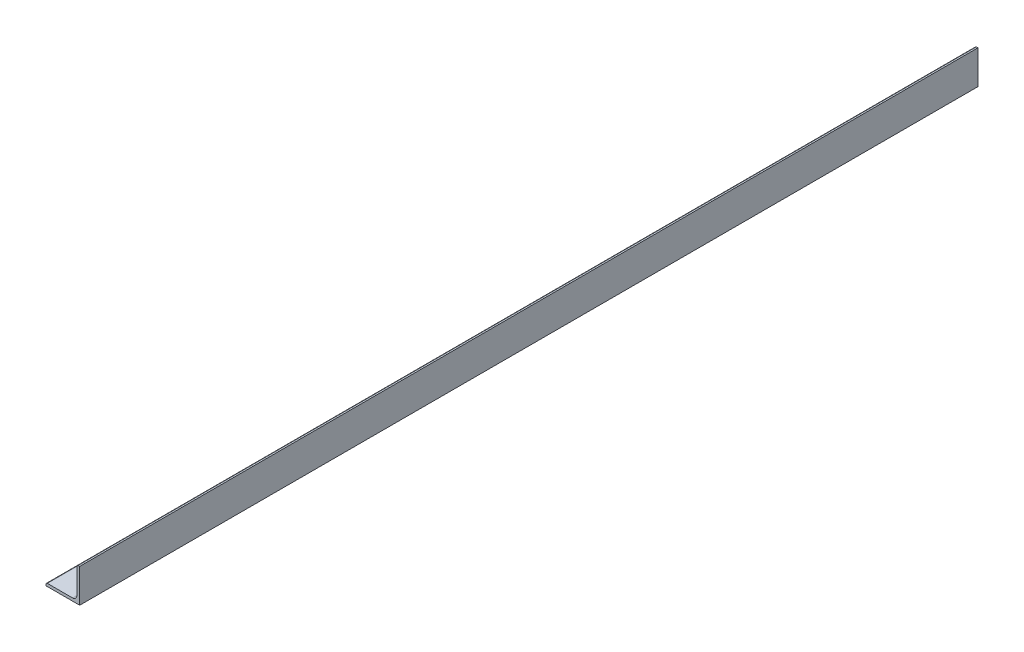
ISO-10303-21;
HEADER;
FILE_DESCRIPTION(('STEP AP214'),'2;1');
FILE_NAME('part.step','',(''),(''),'','','');
FILE_SCHEMA(('AUTOMOTIVE_DESIGN { 1 0 10303 214 1 1 1 1 }'));
ENDSEC;
DATA;
#1=APPLICATION_CONTEXT('core data for automotive mechanical design processes');
#2=APPLICATION_PROTOCOL_DEFINITION('international standard','automotive_design',2000,#1);
#3=PRODUCT_CONTEXT('',#1,'mechanical');
#4=PRODUCT('Part','Part','',(#3));
#5=PRODUCT_RELATED_PRODUCT_CATEGORY('part','',(#4));
#6=PRODUCT_DEFINITION_FORMATION('','',#4);
#7=PRODUCT_DEFINITION_CONTEXT('part definition',#1,'design');
#8=PRODUCT_DEFINITION('design','',#6,#7);
#9=PRODUCT_DEFINITION_SHAPE('','',#8);
#10=(LENGTH_UNIT() NAMED_UNIT(*) SI_UNIT(.MILLI.,.METRE.));
#11=(NAMED_UNIT(*) PLANE_ANGLE_UNIT() SI_UNIT($,.RADIAN.));
#12=(NAMED_UNIT(*) SI_UNIT($,.STERADIAN.) SOLID_ANGLE_UNIT());
#13=UNCERTAINTY_MEASURE_WITH_UNIT(LENGTH_MEASURE(1.E-05),#10,'distance_accuracy_value','');
#14=(GEOMETRIC_REPRESENTATION_CONTEXT(3) GLOBAL_UNCERTAINTY_ASSIGNED_CONTEXT((#13)) GLOBAL_UNIT_ASSIGNED_CONTEXT((#10,
#11,#12)) REPRESENTATION_CONTEXT('',''));
#15=CARTESIAN_POINT('',(0.,0.,0.));
#16=DIRECTION('',(0.,0.,1.));
#17=DIRECTION('',(1.,0.,0.));
#18=AXIS2_PLACEMENT_3D('',#15,#16,#17);
#19=CARTESIAN_POINT('',(-9.525,-8.73125000000001,254.));
#20=DIRECTION('',(1.,0.,0.));
#21=DIRECTION('',(0.,0.,-1.));
#22=AXIS2_PLACEMENT_3D('',#19,#20,#21);
#23=PLANE('',#22);
#24=DIRECTION('',(0.,-1.,0.));
#25=VECTOR('',#24,1.);
#26=CARTESIAN_POINT('',(-9.525,-8.73125000000001,-254.));
#27=LINE('',#26,#25);
#28=CARTESIAN_POINT('',(-9.525,-8.73125000000001,-254.));
#29=VERTEX_POINT('',#28);
#30=CARTESIAN_POINT('',(-9.525,-9.525,-254.));
#31=VERTEX_POINT('',#30);
#32=EDGE_CURVE('E236',#29,#31,#27,.T.);
#33=ORIENTED_EDGE('',*,*,#32,.T.);
#34=DIRECTION('',(0.,0.,-1.));
#35=VECTOR('',#34,1.);
#36=CARTESIAN_POINT('',(-9.525,-9.525,254.));
#37=LINE('',#36,#35);
#38=CARTESIAN_POINT('',(-9.525,-9.525,254.));
#39=VERTEX_POINT('',#38);
#40=EDGE_CURVE('E309',#39,#31,#37,.T.);
#41=ORIENTED_EDGE('',*,*,#40,.F.);
#42=DIRECTION('',(0.,-1.,0.));
#43=VECTOR('',#42,1.);
#44=CARTESIAN_POINT('',(-9.525,-8.73125000000001,254.));
#45=LINE('',#44,#43);
#46=CARTESIAN_POINT('',(-9.525,-8.73125000000001,254.));
#47=VERTEX_POINT('',#46);
#48=EDGE_CURVE('E237',#47,#39,#45,.T.);
#49=ORIENTED_EDGE('',*,*,#48,.F.);
#50=DIRECTION('',(0.,0.,-1.));
#51=VECTOR('',#50,1.);
#52=CARTESIAN_POINT('',(-9.525,-8.73125000000001,254.));
#53=LINE('',#52,#51);
#54=EDGE_CURVE('E170',#47,#29,#53,.T.);
#55=ORIENTED_EDGE('',*,*,#54,.T.);
#56=EDGE_LOOP('',(#33,#41,#49,#55));
#57=FACE_BOUND('',#56,.T.);
#58=ADVANCED_FACE('F45',(#57),#23,.F.);
#59=CARTESIAN_POINT('',(-9.525,-9.525,254.));
#60=DIRECTION('',(0.,1.,0.));
#61=DIRECTION('',(-1.,0.,0.));
#62=AXIS2_PLACEMENT_3D('',#59,#60,#61);
#63=PLANE('',#62);
#64=CARTESIAN_POINT('',(3.17499999999998,-9.525,-241.3));
#65=DIRECTION('',(0.,-1.,0.));
#66=DIRECTION('',(0.,0.,-1.));
#67=AXIS2_PLACEMENT_3D('',#64,#65,#66);
#68=CIRCLE('',#67,2.48919999999999);
#69=CARTESIAN_POINT('',(3.17499999999998,-9.525,-243.7892));
#70=VERTEX_POINT('',#69);
#71=EDGE_CURVE('E154',#70,#70,#68,.T.);
#72=ORIENTED_EDGE('',*,*,#71,.F.);
#73=EDGE_LOOP('',(#72));
#74=FACE_BOUND('',#73,.T.);
#75=CARTESIAN_POINT('',(3.17499999999997,-9.525,-215.9));
#76=DIRECTION('',(0.,-1.,0.));
#77=DIRECTION('',(0.,0.,-1.));
#78=AXIS2_PLACEMENT_3D('',#75,#76,#77);
#79=CIRCLE('',#78,2.48919999999999);
#80=CARTESIAN_POINT('',(3.17499999999997,-9.525,-218.3892));
#81=VERTEX_POINT('',#80);
#82=EDGE_CURVE('E153',#81,#81,#79,.T.);
#83=ORIENTED_EDGE('',*,*,#82,.F.);
#84=EDGE_LOOP('',(#83));
#85=FACE_BOUND('',#84,.T.);
#86=CARTESIAN_POINT('',(3.17499999999961,-9.525,241.3));
#87=DIRECTION('',(0.,-1.,0.));
#88=DIRECTION('',(0.,0.,-1.));
#89=AXIS2_PLACEMENT_3D('',#86,#87,#88);
#90=CIRCLE('',#89,2.48919999999999);
#91=CARTESIAN_POINT('',(3.17499999999961,-9.525,238.8108));
#92=VERTEX_POINT('',#91);
#93=EDGE_CURVE('E229',#92,#92,#90,.T.);
#94=ORIENTED_EDGE('',*,*,#93,.F.);
#95=EDGE_LOOP('',(#94));
#96=FACE_BOUND('',#95,.T.);
#97=CARTESIAN_POINT('',(3.17499999999963,-9.525,215.9));
#98=DIRECTION('',(0.,-1.,0.));
#99=DIRECTION('',(0.,0.,-1.));
#100=AXIS2_PLACEMENT_3D('',#97,#98,#99);
#101=CIRCLE('',#100,2.48919999999999);
#102=CARTESIAN_POINT('',(3.17499999999963,-9.525,213.4108));
#103=VERTEX_POINT('',#102);
#104=EDGE_CURVE('E228',#103,#103,#101,.T.);
#105=ORIENTED_EDGE('',*,*,#104,.F.);
#106=EDGE_LOOP('',(#105));
#107=FACE_BOUND('',#106,.T.);
#108=DIRECTION('',(1.,0.,0.));
#109=VECTOR('',#108,1.);
#110=CARTESIAN_POINT('',(-9.525,-9.525,-254.));
#111=LINE('',#110,#109);
#112=CARTESIAN_POINT('',(9.525,-9.525,-254.));
#113=VERTEX_POINT('',#112);
#114=EDGE_CURVE('E269',#31,#113,#111,.T.);
#115=ORIENTED_EDGE('',*,*,#114,.T.);
#116=DIRECTION('',(0.,0.,-1.));
#117=VECTOR('',#116,1.);
#118=CARTESIAN_POINT('',(9.525,-9.525,254.));
#119=LINE('',#118,#117);
#120=CARTESIAN_POINT('',(9.525,-9.525,254.));
#121=VERTEX_POINT('',#120);
#122=EDGE_CURVE('E312',#121,#113,#119,.T.);
#123=ORIENTED_EDGE('',*,*,#122,.F.);
#124=DIRECTION('',(1.,0.,0.));
#125=VECTOR('',#124,1.);
#126=CARTESIAN_POINT('',(-9.525,-9.525,254.));
#127=LINE('',#126,#125);
#128=EDGE_CURVE('E241',#39,#121,#127,.T.);
#129=ORIENTED_EDGE('',*,*,#128,.F.);
#130=ORIENTED_EDGE('',*,*,#40,.T.);
#131=EDGE_LOOP('',(#115,#123,#129,#130));
#132=FACE_BOUND('',#131,.T.);
#133=ADVANCED_FACE('F310',(#74,#85,#96,#107,#132),#63,.F.);
#134=CARTESIAN_POINT('',(9.525,-9.525,254.));
#135=DIRECTION('',(-1.,0.,0.));
#136=DIRECTION('',(0.,-1.,0.));
#137=AXIS2_PLACEMENT_3D('',#134,#135,#136);
#138=PLANE('',#137);
#139=DIRECTION('',(0.,1.,0.));
#140=VECTOR('',#139,1.);
#141=CARTESIAN_POINT('',(9.525,-9.525,-254.));
#142=LINE('',#141,#140);
#143=CARTESIAN_POINT('',(9.525,9.525,-254.));
#144=VERTEX_POINT('',#143);
#145=EDGE_CURVE('E272',#113,#144,#142,.T.);
#146=ORIENTED_EDGE('',*,*,#145,.T.);
#147=DIRECTION('',(0.,0.,-1.));
#148=VECTOR('',#147,1.);
#149=CARTESIAN_POINT('',(9.525,9.525,254.));
#150=LINE('',#149,#148);
#151=CARTESIAN_POINT('',(9.525,9.525,254.));
#152=VERTEX_POINT('',#151);
#153=EDGE_CURVE('E316',#152,#144,#150,.T.);
#154=ORIENTED_EDGE('',*,*,#153,.F.);
#155=DIRECTION('',(0.,1.,0.));
#156=VECTOR('',#155,1.);
#157=CARTESIAN_POINT('',(9.525,-9.525,254.));
#158=LINE('',#157,#156);
#159=EDGE_CURVE('E245',#121,#152,#158,.T.);
#160=ORIENTED_EDGE('',*,*,#159,.F.);
#161=ORIENTED_EDGE('',*,*,#122,.T.);
#162=EDGE_LOOP('',(#146,#154,#160,#161));
#163=FACE_BOUND('',#162,.T.);
#164=ADVANCED_FACE('F358',(#163),#138,.F.);
#165=CARTESIAN_POINT('',(8.73125000000001,9.525,254.));
#166=DIRECTION('',(0.,-1.,0.));
#167=DIRECTION('',(1.,0.,0.));
#168=AXIS2_PLACEMENT_3D('',#165,#166,#167);
#169=PLANE('',#168);
#170=DIRECTION('',(-1.,0.,0.));
#171=VECTOR('',#170,1.);
#172=CARTESIAN_POINT('',(8.73125000000001,9.525,-254.));
#173=LINE('',#172,#171);
#174=CARTESIAN_POINT('',(8.73125000000001,9.525,-254.));
#175=VERTEX_POINT('',#174);
#176=EDGE_CURVE('E275',#144,#175,#173,.T.);
#177=ORIENTED_EDGE('',*,*,#176,.T.);
#178=DIRECTION('',(0.,0.,-1.));
#179=VECTOR('',#178,1.);
#180=CARTESIAN_POINT('',(8.73125000000001,9.525,254.));
#181=LINE('',#180,#179);
#182=CARTESIAN_POINT('',(8.73125000000001,9.525,254.));
#183=VERTEX_POINT('',#182);
#184=EDGE_CURVE('E326',#183,#175,#181,.T.);
#185=ORIENTED_EDGE('',*,*,#184,.F.);
#186=DIRECTION('',(-1.,0.,0.));
#187=VECTOR('',#186,1.);
#188=CARTESIAN_POINT('',(8.73125000000001,9.525,254.));
#189=LINE('',#188,#187);
#190=EDGE_CURVE('E248',#152,#183,#189,.T.);
#191=ORIENTED_EDGE('',*,*,#190,.F.);
#192=ORIENTED_EDGE('',*,*,#153,.T.);
#193=EDGE_LOOP('',(#177,#185,#191,#192));
#194=FACE_BOUND('',#193,.T.);
#195=ADVANCED_FACE('F363',(#194),#169,.F.);
#196=CARTESIAN_POINT('',(8.73125000000001,8.73125000000002,254.));
#197=DIRECTION('',(0.,0.,-1.));
#198=DIRECTION('',(-1.,0.,0.));
#199=AXIS2_PLACEMENT_3D('',#196,#197,#198);
#200=CYLINDRICAL_SURFACE('',#199,0.793749999999986);
#201=CARTESIAN_POINT('',(8.73125000000001,8.73125000000002,-254.));
#202=DIRECTION('',(0.,0.,1.));
#203=DIRECTION('',(-1.,0.,0.));
#204=AXIS2_PLACEMENT_3D('',#201,#202,#203);
#205=CIRCLE('',#204,0.793749999999986);
#206=CARTESIAN_POINT('',(7.93750000000003,8.73125000000002,-254.));
#207=VERTEX_POINT('',#206);
#208=EDGE_CURVE('E278',#175,#207,#205,.T.);
#209=ORIENTED_EDGE('',*,*,#208,.T.);
#210=DIRECTION('',(0.,0.,-1.));
#211=VECTOR('',#210,1.);
#212=CARTESIAN_POINT('',(7.93750000000003,8.73125000000002,254.));
#213=LINE('',#212,#211);
#214=CARTESIAN_POINT('',(7.93750000000003,8.73125000000002,254.));
#215=VERTEX_POINT('',#214);
#216=EDGE_CURVE('E181',#215,#207,#213,.T.);
#217=ORIENTED_EDGE('',*,*,#216,.F.);
#218=CARTESIAN_POINT('',(8.73125000000001,8.73125000000002,254.));
#219=DIRECTION('',(0.,0.,1.));
#220=DIRECTION('',(-1.,0.,0.));
#221=AXIS2_PLACEMENT_3D('',#218,#219,#220);
#222=CIRCLE('',#221,0.793749999999986);
#223=EDGE_CURVE('E251',#183,#215,#222,.T.);
#224=ORIENTED_EDGE('',*,*,#223,.F.);
#225=ORIENTED_EDGE('',*,*,#184,.T.);
#226=EDGE_LOOP('',(#209,#217,#224,#225));
#227=FACE_BOUND('',#226,.T.);
#228=ADVANCED_FACE('F371',(#227),#200,.T.);
#229=CARTESIAN_POINT('',(7.93750000000003,8.73125000000002,254.));
#230=DIRECTION('',(1.,0.,0.));
#231=DIRECTION('',(0.,1.,0.));
#232=AXIS2_PLACEMENT_3D('',#229,#230,#231);
#233=PLANE('',#232);
#234=DIRECTION('',(0.,-1.,0.));
#235=VECTOR('',#234,1.);
#236=CARTESIAN_POINT('',(7.93750000000003,8.73125000000002,-254.));
#237=LINE('',#236,#235);
#238=CARTESIAN_POINT('',(7.93750000000003,-5.54990000000002,-254.));
#239=VERTEX_POINT('',#238);
#240=EDGE_CURVE('E281',#207,#239,#237,.T.);
#241=ORIENTED_EDGE('',*,*,#240,.T.);
#242=DIRECTION('',(0.,0.,-1.));
#243=VECTOR('',#242,1.);
#244=CARTESIAN_POINT('',(7.93750000000003,-5.54990000000002,254.));
#245=LINE('',#244,#243);
#246=CARTESIAN_POINT('',(7.93750000000003,-5.54990000000002,254.));
#247=VERTEX_POINT('',#246);
#248=EDGE_CURVE('E175',#247,#239,#245,.T.);
#249=ORIENTED_EDGE('',*,*,#248,.F.);
#250=DIRECTION('',(0.,-1.,0.));
#251=VECTOR('',#250,1.);
#252=CARTESIAN_POINT('',(7.93750000000003,8.73125000000002,254.));
#253=LINE('',#252,#251);
#254=EDGE_CURVE('E254',#215,#247,#253,.T.);
#255=ORIENTED_EDGE('',*,*,#254,.F.);
#256=ORIENTED_EDGE('',*,*,#216,.T.);
#257=EDGE_LOOP('',(#241,#249,#255,#256));
#258=FACE_BOUND('',#257,.T.);
#259=ADVANCED_FACE('F336',(#258),#233,.F.);
#260=CARTESIAN_POINT('',(5.54990000000003,-5.54990000000002,254.));
#261=DIRECTION('',(0.,0.,-1.));
#262=DIRECTION('',(-1.,0.,0.));
#263=AXIS2_PLACEMENT_3D('',#260,#261,#262);
#264=CYLINDRICAL_SURFACE('',#263,2.3876);
#265=DIRECTION('',(0.,0.,-1.));
#266=VECTOR('',#265,1.);
#267=CARTESIAN_POINT('',(5.54990000000003,-7.93750000000002,254.));
#268=LINE('',#267,#266);
#269=CARTESIAN_POINT('',(5.54990000000003,-7.93750000000002,-242.045631698629));
#270=VERTEX_POINT('',#269);
#271=CARTESIAN_POINT('',(5.54990000000003,-7.93750000000002,-254.));
#272=VERTEX_POINT('',#271);
#273=EDGE_CURVE('E149',#270,#272,#268,.T.);
#274=ORIENTED_EDGE('',*,*,#273,.F.);
#275=CARTESIAN_POINT('',(5.54990000000003,-7.93750000000002,-242.045631698629));
#276=CARTESIAN_POINT('',(5.57113199587804,-7.93747813500096,-241.978030268757));
#277=CARTESIAN_POINT('',(5.5894626615185,-7.93721590896929,-241.909521344217));
#278=CARTESIAN_POINT('',(5.62022240863203,-7.93651960903765,-241.771185636151));
#279=CARTESIAN_POINT('',(5.63265098780649,-7.93608552051705,-241.701358740983));
#280=CARTESIAN_POINT('',(5.65126878222817,-7.93536359909243,-241.562648301479));
#281=CARTESIAN_POINT('',(5.65760594317538,-7.93507238710157,-241.493784692655));
#282=CARTESIAN_POINT('',(5.6645339574641,-7.93474857844322,-241.355797691865));
#283=CARTESIAN_POINT('',(5.66512597593408,-7.93471592933881,-241.286674355417));
#284=CARTESIAN_POINT('',(5.65914800580867,-7.93500720687492,-241.106373299725));
#285=CARTESIAN_POINT('',(5.64798195441919,-7.93556114280814,-240.995300509627));
#286=CARTESIAN_POINT('',(5.61999750018834,-7.93648721305121,-240.829528136613));
#287=CARTESIAN_POINT('',(5.60862027186373,-7.93681563556644,-240.773844410845));
#288=CARTESIAN_POINT('',(5.58208326607098,-7.93731903915807,-240.66337623923));
#289=CARTESIAN_POINT('',(5.56692292548327,-7.93749399737366,-240.608591928557));
#290=CARTESIAN_POINT('',(5.54990000000003,-7.93750000000002,-240.554368301371));
#291=B_SPLINE_CURVE_WITH_KNOTS('',3,(#275,#276,#277,#278,#279,#280,#281,#282,#283,#284,#285,
#286,#287,#288,#289,#290),.UNSPECIFIED.,.F.,.F.,(4,2,2,2,2,2,2,4),(0.,0.212501634654038,
0.425021351075365,0.632238307554722,0.839413239067182,1.17314745011346,1.34354194641262,
1.51396182122618),.UNSPECIFIED.);
#292=CARTESIAN_POINT('',(5.54990000000003,-7.93750000000002,-240.554368301371));
#293=VERTEX_POINT('',#292);
#294=EDGE_CURVE('E11',#270,#293,#291,.T.);
#295=ORIENTED_EDGE('',*,*,#294,.T.);
#296=CARTESIAN_POINT('',(5.54990000000003,-7.93750000000002,-216.645631698629));
#297=VERTEX_POINT('',#296);
#298=EDGE_CURVE('E151',#297,#293,#268,.T.);
#299=ORIENTED_EDGE('',*,*,#298,.F.);
#300=CARTESIAN_POINT('',(5.54990000000003,-7.93750000000002,-216.645631698629));
#301=CARTESIAN_POINT('',(5.57113199587804,-7.93747813500096,-216.578030268757));
#302=CARTESIAN_POINT('',(5.58946266151849,-7.93721590896929,-216.509521344217));
#303=CARTESIAN_POINT('',(5.62022240863202,-7.93651960903765,-216.371185636151));
#304=CARTESIAN_POINT('',(5.63265098780648,-7.93608552051705,-216.301358740983));
#305=CARTESIAN_POINT('',(5.65126878222816,-7.93536359909243,-216.162648301479));
#306=CARTESIAN_POINT('',(5.65760594317537,-7.93507238710157,-216.093784692655));
#307=CARTESIAN_POINT('',(5.66453395746409,-7.93474857844322,-215.955797691865));
#308=CARTESIAN_POINT('',(5.66512597593407,-7.93471592933881,-215.886674355417));
#309=CARTESIAN_POINT('',(5.65914800580866,-7.93500720687492,-215.706373299725));
#310=CARTESIAN_POINT('',(5.64798195441918,-7.93556114280814,-215.595300509627));
#311=CARTESIAN_POINT('',(5.61999750018834,-7.93648721305121,-215.429528136613));
#312=CARTESIAN_POINT('',(5.60862027186373,-7.93681563556644,-215.373844410845));
#313=CARTESIAN_POINT('',(5.58208326607098,-7.93731903915807,-215.26337623923));
#314=CARTESIAN_POINT('',(5.56692292548328,-7.93749399737366,-215.208591928557));
#315=CARTESIAN_POINT('',(5.54990000000004,-7.93750000000002,-215.154368301371));
#316=B_SPLINE_CURVE_WITH_KNOTS('',3,(#300,#301,#302,#303,#304,#305,#306,#307,#308,#309,#310,
#311,#312,#313,#314,#315),.UNSPECIFIED.,.F.,.F.,(4,2,2,2,2,2,2,4),(0.,0.212501634654064,
0.425021351075362,0.632238307554747,0.839413239067207,1.17314745011343,1.34354194641256,
1.51396182122612),.UNSPECIFIED.);
#317=CARTESIAN_POINT('',(5.54990000000003,-7.93750000000002,-215.154368301371));
#318=VERTEX_POINT('',#317);
#319=EDGE_CURVE('E59',#297,#318,#316,.T.);
#320=ORIENTED_EDGE('',*,*,#319,.T.);
#321=CARTESIAN_POINT('',(5.54990000000003,-7.93750000000002,215.154368301373));
#322=VERTEX_POINT('',#321);
#323=EDGE_CURVE('E167',#322,#318,#268,.T.);
#324=ORIENTED_EDGE('',*,*,#323,.F.);
#325=CARTESIAN_POINT('',(5.54990000000003,-7.93750000000002,215.154368301373));
#326=CARTESIAN_POINT('',(5.57113199587801,-7.93747813500096,215.221969731245));
#327=CARTESIAN_POINT('',(5.58946266151843,-7.93721590896929,215.290478655784));
#328=CARTESIAN_POINT('',(5.6202224086319,-7.93651960903766,215.428814363851));
#329=CARTESIAN_POINT('',(5.63265098780633,-7.93608552051705,215.498641259019));
#330=CARTESIAN_POINT('',(5.65126878222794,-7.93536359909244,215.637351698523));
#331=CARTESIAN_POINT('',(5.65760594317512,-7.93507238710158,215.706215307346));
#332=CARTESIAN_POINT('',(5.66453395746378,-7.93474857844323,215.844202308136));
#333=CARTESIAN_POINT('',(5.66512597593372,-7.93471592933883,215.913325644585));
#334=CARTESIAN_POINT('',(5.65914800580825,-7.93500720687494,216.093626700276));
#335=CARTESIAN_POINT('',(5.64798195441878,-7.93556114280816,216.204699490373));
#336=CARTESIAN_POINT('',(5.61999750018802,-7.93648721305122,216.370471863388));
#337=CARTESIAN_POINT('',(5.60862027186346,-7.93681563556644,216.426155589155));
#338=CARTESIAN_POINT('',(5.58208326607082,-7.93731903915807,216.53662376077));
#339=CARTESIAN_POINT('',(5.56692292548319,-7.93749399737366,216.591408071442));
#340=CARTESIAN_POINT('',(5.54990000000003,-7.93750000000002,216.645631698628));
#341=B_SPLINE_CURVE_WITH_KNOTS('',3,(#325,#326,#327,#328,#329,#330,#331,#332,#333,#334,#335,
#336,#337,#338,#339,#340),.UNSPECIFIED.,.F.,.F.,(4,2,2,2,2,2,2,4),(0.,0.21250163465404,
0.425021351075349,0.63223830755467,0.839413239067185,1.17314745011233,1.34354194641088,
1.51396182122386),.UNSPECIFIED.);
#342=CARTESIAN_POINT('',(5.54990000000003,-7.93750000000002,216.645631698628));
#343=VERTEX_POINT('',#342);
#344=EDGE_CURVE('E190',#322,#343,#341,.T.);
#345=ORIENTED_EDGE('',*,*,#344,.T.);
#346=CARTESIAN_POINT('',(5.54990000000003,-7.93750000000002,240.554368301373));
#347=VERTEX_POINT('',#346);
#348=EDGE_CURVE('E168',#347,#343,#268,.T.);
#349=ORIENTED_EDGE('',*,*,#348,.F.);
#350=CARTESIAN_POINT('',(5.54990000000003,-7.93750000000002,240.554368301373));
#351=CARTESIAN_POINT('',(5.571131995878,-7.93747813500096,240.621969731245));
#352=CARTESIAN_POINT('',(5.58946266151843,-7.93721590896929,240.690478655784));
#353=CARTESIAN_POINT('',(5.62022240863189,-7.93651960903766,240.828814363851));
#354=CARTESIAN_POINT('',(5.63265098780632,-7.93608552051705,240.898641259019));
#355=CARTESIAN_POINT('',(5.65126878222793,-7.93536359909244,241.037351698523));
#356=CARTESIAN_POINT('',(5.65760594317511,-7.93507238710158,241.106215307346));
#357=CARTESIAN_POINT('',(5.66453395746376,-7.93474857844323,241.244202308136));
#358=CARTESIAN_POINT('',(5.6651259759337,-7.93471592933883,241.313325644585));
#359=CARTESIAN_POINT('',(5.65914800580823,-7.93500720687494,241.493626700276));
#360=CARTESIAN_POINT('',(5.64798195441876,-7.93556114280816,241.604699490373));
#361=CARTESIAN_POINT('',(5.61999750018801,-7.93648721305122,241.770471863388));
#362=CARTESIAN_POINT('',(5.60862027186345,-7.93681563556644,241.826155589155));
#363=CARTESIAN_POINT('',(5.58208326607081,-7.93731903915807,241.936623760769));
#364=CARTESIAN_POINT('',(5.56692292548318,-7.93749399737366,241.991408071442));
#365=CARTESIAN_POINT('',(5.54990000000003,-7.93750000000002,242.045631698628));
#366=B_SPLINE_CURVE_WITH_KNOTS('',3,(#350,#351,#352,#353,#354,#355,#356,#357,#358,#359,#360,
#361,#362,#363,#364,#365),.UNSPECIFIED.,.F.,.F.,(4,2,2,2,2,2,2,4),(0.,0.212501634654011,
0.425021351075348,0.632238307554723,0.839413239067182,1.17314745011224,1.3435419464108,
1.51396182122374),.UNSPECIFIED.);
#367=CARTESIAN_POINT('',(5.54990000000003,-7.93750000000002,242.045631698628));
#368=VERTEX_POINT('',#367);
#369=EDGE_CURVE('E219',#347,#368,#366,.T.);
#370=ORIENTED_EDGE('',*,*,#369,.T.);
#371=CARTESIAN_POINT('',(5.54990000000003,-7.93750000000002,254.));
#372=VERTEX_POINT('',#371);
#373=EDGE_CURVE('E164',#372,#368,#268,.T.);
#374=ORIENTED_EDGE('',*,*,#373,.F.);
#375=CARTESIAN_POINT('',(5.54990000000003,-5.54990000000002,254.));
#376=DIRECTION('',(0.,0.,-1.));
#377=DIRECTION('',(-1.,0.,0.));
#378=AXIS2_PLACEMENT_3D('',#375,#376,#377);
#379=CIRCLE('',#378,2.3876);
#380=EDGE_CURVE('E257',#247,#372,#379,.T.);
#381=ORIENTED_EDGE('',*,*,#380,.F.);
#382=ORIENTED_EDGE('',*,*,#248,.T.);
#383=CARTESIAN_POINT('',(5.54990000000003,-5.54990000000002,-254.));
#384=DIRECTION('',(0.,0.,-1.));
#385=DIRECTION('',(-1.,0.,0.));
#386=AXIS2_PLACEMENT_3D('',#383,#384,#385);
#387=CIRCLE('',#386,2.3876);
#388=EDGE_CURVE('E159',#239,#272,#387,.T.);
#389=ORIENTED_EDGE('',*,*,#388,.T.);
#390=EDGE_LOOP('',(#274,#295,#299,#320,#324,#345,#349,#370,#374,#381,#382,#389));
#391=FACE_BOUND('',#390,.T.);
#392=ADVANCED_FACE('F156',(#391),#264,.F.);
#393=CARTESIAN_POINT('',(5.54990000000003,-7.93750000000002,254.));
#394=DIRECTION('',(0.,-1.,0.));
#395=DIRECTION('',(1.,0.,0.));
#396=AXIS2_PLACEMENT_3D('',#393,#394,#395);
#397=PLANE('',#396);
#398=ORIENTED_EDGE('',*,*,#298,.T.);
#399=CARTESIAN_POINT('',(3.17499999999998,-7.93750000000002,-241.3));
#400=DIRECTION('',(0.,-1.,0.));
#401=DIRECTION('',(1.,0.,0.));
#402=AXIS2_PLACEMENT_3D('',#399,#400,#401);
#403=CIRCLE('',#402,2.48919999999999);
#404=EDGE_CURVE('E65',#293,#270,#403,.T.);
#405=ORIENTED_EDGE('',*,*,#404,.T.);
#406=ORIENTED_EDGE('',*,*,#273,.T.);
#407=DIRECTION('',(-1.,0.,0.));
#408=VECTOR('',#407,1.);
#409=CARTESIAN_POINT('',(5.54990000000003,-7.93750000000002,-254.));
#410=LINE('',#409,#408);
#411=CARTESIAN_POINT('',(-8.73125000000001,-7.93750000000003,-254.));
#412=VERTEX_POINT('',#411);
#413=EDGE_CURVE('E286',#272,#412,#410,.T.);
#414=ORIENTED_EDGE('',*,*,#413,.T.);
#415=DIRECTION('',(0.,0.,-1.));
#416=VECTOR('',#415,1.);
#417=CARTESIAN_POINT('',(-8.73125000000001,-7.93750000000003,254.));
#418=LINE('',#417,#416);
#419=CARTESIAN_POINT('',(-8.73125000000001,-7.93750000000003,254.));
#420=VERTEX_POINT('',#419);
#421=EDGE_CURVE('E162',#420,#412,#418,.T.);
#422=ORIENTED_EDGE('',*,*,#421,.F.);
#423=DIRECTION('',(-1.,0.,0.));
#424=VECTOR('',#423,1.);
#425=CARTESIAN_POINT('',(5.54990000000003,-7.93750000000002,254.));
#426=LINE('',#425,#424);
#427=EDGE_CURVE('E260',#372,#420,#426,.T.);
#428=ORIENTED_EDGE('',*,*,#427,.F.);
#429=ORIENTED_EDGE('',*,*,#373,.T.);
#430=CARTESIAN_POINT('',(3.17499999999961,-7.93750000000002,241.3));
#431=DIRECTION('',(0.,-1.,0.));
#432=DIRECTION('',(1.,0.,0.));
#433=AXIS2_PLACEMENT_3D('',#430,#431,#432);
#434=CIRCLE('',#433,2.48919999999999);
#435=EDGE_CURVE('E192',#368,#347,#434,.T.);
#436=ORIENTED_EDGE('',*,*,#435,.T.);
#437=ORIENTED_EDGE('',*,*,#348,.T.);
#438=CARTESIAN_POINT('',(3.17499999999963,-7.93750000000002,215.9));
#439=DIRECTION('',(0.,-1.,0.));
#440=DIRECTION('',(1.,0.,0.));
#441=AXIS2_PLACEMENT_3D('',#438,#439,#440);
#442=CIRCLE('',#441,2.48919999999999);
#443=EDGE_CURVE('E187',#343,#322,#442,.T.);
#444=ORIENTED_EDGE('',*,*,#443,.T.);
#445=ORIENTED_EDGE('',*,*,#323,.T.);
#446=CARTESIAN_POINT('',(3.17499999999997,-7.93750000000002,-215.9));
#447=DIRECTION('',(0.,-1.,0.));
#448=DIRECTION('',(1.,0.,0.));
#449=AXIS2_PLACEMENT_3D('',#446,#447,#448);
#450=CIRCLE('',#449,2.48919999999999);
#451=EDGE_CURVE('E71',#318,#297,#450,.T.);
#452=ORIENTED_EDGE('',*,*,#451,.T.);
#453=EDGE_LOOP('',(#398,#405,#406,#414,#422,#428,#429,#436,#437,#444,#445,#452));
#454=FACE_BOUND('',#453,.T.);
#455=ADVANCED_FACE('F148',(#454),#397,.F.);
#456=CARTESIAN_POINT('',(-8.73125000000001,-8.73125000000001,254.));
#457=DIRECTION('',(0.,0.,-1.));
#458=DIRECTION('',(-1.,0.,0.));
#459=AXIS2_PLACEMENT_3D('',#456,#457,#458);
#460=CYLINDRICAL_SURFACE('',#459,0.793749999999986);
#461=CARTESIAN_POINT('',(-8.73125000000001,-8.73125000000001,-254.));
#462=DIRECTION('',(0.,0.,1.));
#463=DIRECTION('',(-1.,0.,0.));
#464=AXIS2_PLACEMENT_3D('',#461,#462,#463);
#465=CIRCLE('',#464,0.793749999999986);
#466=EDGE_CURVE('E242',#412,#29,#465,.T.);
#467=ORIENTED_EDGE('',*,*,#466,.T.);
#468=ORIENTED_EDGE('',*,*,#54,.F.);
#469=CARTESIAN_POINT('',(-8.73125000000001,-8.73125000000001,254.));
#470=DIRECTION('',(0.,0.,1.));
#471=DIRECTION('',(-1.,0.,0.));
#472=AXIS2_PLACEMENT_3D('',#469,#470,#471);
#473=CIRCLE('',#472,0.793749999999986);
#474=EDGE_CURVE('E263',#420,#47,#473,.T.);
#475=ORIENTED_EDGE('',*,*,#474,.F.);
#476=ORIENTED_EDGE('',*,*,#421,.T.);
#477=EDGE_LOOP('',(#467,#468,#475,#476));
#478=FACE_BOUND('',#477,.T.);
#479=ADVANCED_FACE('F342',(#478),#460,.T.);
#480=CARTESIAN_POINT('',(8.73125000000001,8.73125000000002,254.));
#481=DIRECTION('',(0.,0.,-1.));
#482=DIRECTION('',(-1.,0.,0.));
#483=AXIS2_PLACEMENT_3D('',#480,#481,#482);
#484=PLANE('',#483);
#485=ORIENTED_EDGE('',*,*,#48,.T.);
#486=ORIENTED_EDGE('',*,*,#128,.T.);
#487=ORIENTED_EDGE('',*,*,#159,.T.);
#488=ORIENTED_EDGE('',*,*,#190,.T.);
#489=ORIENTED_EDGE('',*,*,#223,.T.);
#490=ORIENTED_EDGE('',*,*,#254,.T.);
#491=ORIENTED_EDGE('',*,*,#380,.T.);
#492=ORIENTED_EDGE('',*,*,#427,.T.);
#493=ORIENTED_EDGE('',*,*,#474,.T.);
#494=EDGE_LOOP('',(#485,#486,#487,#488,#489,#490,#491,#492,#493));
#495=FACE_BOUND('',#494,.T.);
#496=ADVANCED_FACE('F344',(#495),#484,.F.);
#497=CARTESIAN_POINT('',(8.73125000000001,8.73125000000002,-254.));
#498=DIRECTION('',(0.,0.,-1.));
#499=DIRECTION('',(-1.,0.,0.));
#500=AXIS2_PLACEMENT_3D('',#497,#498,#499);
#501=PLANE('',#500);
#502=ORIENTED_EDGE('',*,*,#32,.F.);
#503=ORIENTED_EDGE('',*,*,#466,.F.);
#504=ORIENTED_EDGE('',*,*,#413,.F.);
#505=ORIENTED_EDGE('',*,*,#388,.F.);
#506=ORIENTED_EDGE('',*,*,#240,.F.);
#507=ORIENTED_EDGE('',*,*,#208,.F.);
#508=ORIENTED_EDGE('',*,*,#176,.F.);
#509=ORIENTED_EDGE('',*,*,#145,.F.);
#510=ORIENTED_EDGE('',*,*,#114,.F.);
#511=EDGE_LOOP('',(#502,#503,#504,#505,#506,#507,#508,#509,#510));
#512=FACE_BOUND('',#511,.T.);
#513=ADVANCED_FACE('F302',(#512),#501,.T.);
#514=CARTESIAN_POINT('',(3.17499999999963,-9.525,215.9));
#515=DIRECTION('',(0.,-1.,0.));
#516=DIRECTION('',(0.,0.,-1.));
#517=AXIS2_PLACEMENT_3D('',#514,#515,#516);
#518=CYLINDRICAL_SURFACE('',#517,2.48919999999999);
#519=ORIENTED_EDGE('',*,*,#104,.T.);
#520=EDGE_LOOP('',(#519));
#521=FACE_BOUND('',#520,.T.);
#522=ORIENTED_EDGE('',*,*,#344,.F.);
#523=ORIENTED_EDGE('',*,*,#443,.F.);
#524=EDGE_LOOP('',(#522,#523));
#525=FACE_BOUND('',#524,.T.);
#526=ADVANCED_FACE('F214',(#521,#525),#518,.F.);
#527=CARTESIAN_POINT('',(3.17499999999961,-9.525,241.3));
#528=DIRECTION('',(0.,-1.,0.));
#529=DIRECTION('',(0.,0.,-1.));
#530=AXIS2_PLACEMENT_3D('',#527,#528,#529);
#531=CYLINDRICAL_SURFACE('',#530,2.48919999999999);
#532=ORIENTED_EDGE('',*,*,#93,.T.);
#533=EDGE_LOOP('',(#532));
#534=FACE_BOUND('',#533,.T.);
#535=ORIENTED_EDGE('',*,*,#435,.F.);
#536=ORIENTED_EDGE('',*,*,#369,.F.);
#537=EDGE_LOOP('',(#535,#536));
#538=FACE_BOUND('',#537,.T.);
#539=ADVANCED_FACE('F208',(#534,#538),#531,.F.);
#540=CARTESIAN_POINT('',(3.17499999999997,-9.525,-215.9));
#541=DIRECTION('',(0.,-1.,0.));
#542=DIRECTION('',(0.,0.,-1.));
#543=AXIS2_PLACEMENT_3D('',#540,#541,#542);
#544=CYLINDRICAL_SURFACE('',#543,2.48919999999999);
#545=ORIENTED_EDGE('',*,*,#82,.T.);
#546=EDGE_LOOP('',(#545));
#547=FACE_BOUND('',#546,.T.);
#548=ORIENTED_EDGE('',*,*,#319,.F.);
#549=ORIENTED_EDGE('',*,*,#451,.F.);
#550=EDGE_LOOP('',(#548,#549));
#551=FACE_BOUND('',#550,.T.);
#552=ADVANCED_FACE('F204',(#547,#551),#544,.F.);
#553=CARTESIAN_POINT('',(3.17499999999998,-9.525,-241.3));
#554=DIRECTION('',(0.,-1.,0.));
#555=DIRECTION('',(0.,0.,-1.));
#556=AXIS2_PLACEMENT_3D('',#553,#554,#555);
#557=CYLINDRICAL_SURFACE('',#556,2.48919999999999);
#558=ORIENTED_EDGE('',*,*,#71,.T.);
#559=EDGE_LOOP('',(#558));
#560=FACE_BOUND('',#559,.T.);
#561=ORIENTED_EDGE('',*,*,#294,.F.);
#562=ORIENTED_EDGE('',*,*,#404,.F.);
#563=EDGE_LOOP('',(#561,#562));
#564=FACE_BOUND('',#563,.T.);
#565=ADVANCED_FACE('F142',(#560,#564),#557,.F.);
#566=CLOSED_SHELL('',(#58,#133,#164,#195,#228,#259,#392,#455,#479,#496,#513,#526,#539,#552,#565));
#567=MANIFOLD_SOLID_BREP('B2',#566);
#568=ADVANCED_BREP_SHAPE_REPRESENTATION('',(#18,#567),#14);
#569=SHAPE_DEFINITION_REPRESENTATION(#9,#568);
ENDSEC;
END-ISO-10303-21;
